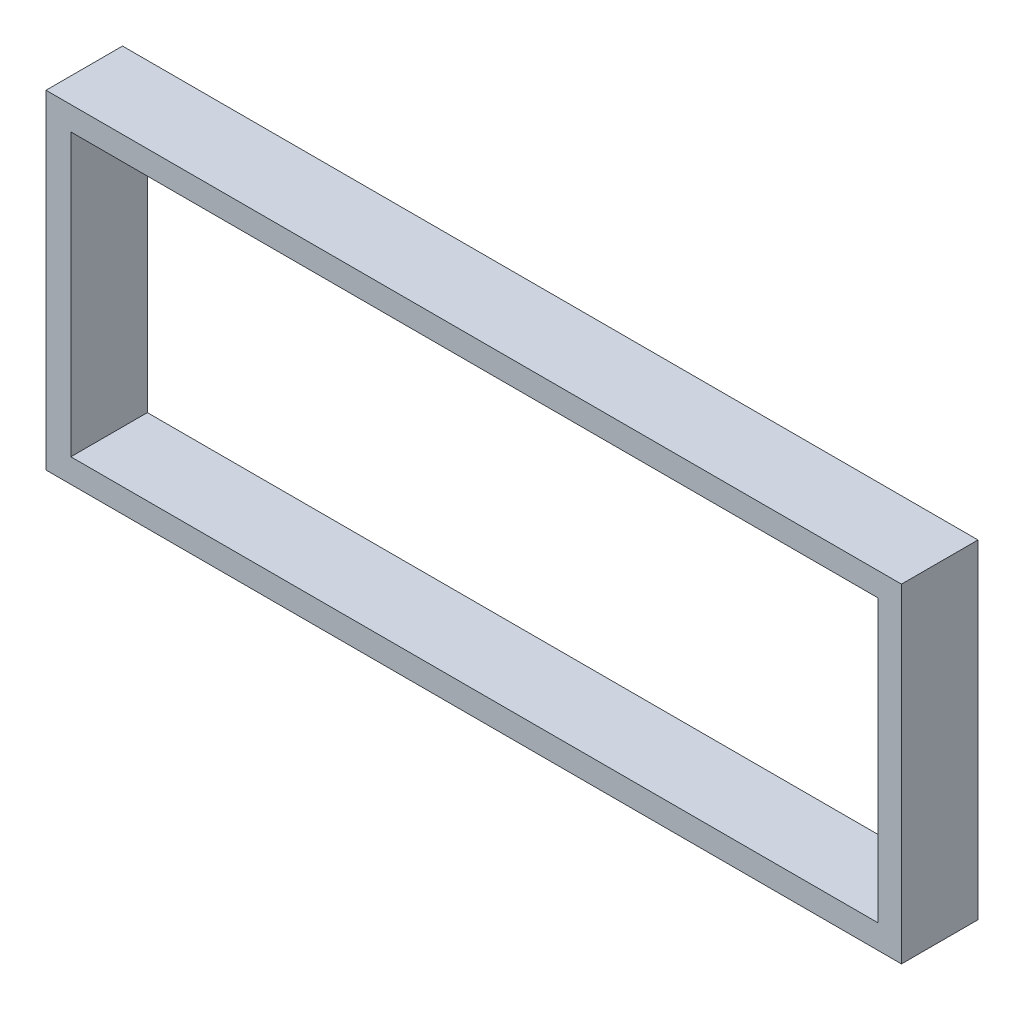
ISO-10303-21;
HEADER;
FILE_DESCRIPTION(('STEP AP214'),'2;1');
FILE_NAME('part.step','',(''),(''),'','','');
FILE_SCHEMA(('AUTOMOTIVE_DESIGN { 1 0 10303 214 1 1 1 1 }'));
ENDSEC;
DATA;
#1=APPLICATION_CONTEXT('core data for automotive mechanical design processes');
#2=APPLICATION_PROTOCOL_DEFINITION('international standard','automotive_design',2000,#1);
#3=PRODUCT_CONTEXT('',#1,'mechanical');
#4=PRODUCT('Part','Part','',(#3));
#5=PRODUCT_RELATED_PRODUCT_CATEGORY('part','',(#4));
#6=PRODUCT_DEFINITION_FORMATION('','',#4);
#7=PRODUCT_DEFINITION_CONTEXT('part definition',#1,'design');
#8=PRODUCT_DEFINITION('design','',#6,#7);
#9=PRODUCT_DEFINITION_SHAPE('','',#8);
#10=(LENGTH_UNIT() NAMED_UNIT(*) SI_UNIT(.MILLI.,.METRE.));
#11=(NAMED_UNIT(*) PLANE_ANGLE_UNIT() SI_UNIT($,.RADIAN.));
#12=(NAMED_UNIT(*) SI_UNIT($,.STERADIAN.) SOLID_ANGLE_UNIT());
#13=UNCERTAINTY_MEASURE_WITH_UNIT(LENGTH_MEASURE(1.E-05),#10,'distance_accuracy_value','');
#14=(GEOMETRIC_REPRESENTATION_CONTEXT(3) GLOBAL_UNCERTAINTY_ASSIGNED_CONTEXT((#13)) GLOBAL_UNIT_ASSIGNED_CONTEXT((#10,
#11,#12)) REPRESENTATION_CONTEXT('',''));
#15=CARTESIAN_POINT('',(0.,0.,0.));
#16=DIRECTION('',(0.,0.,1.));
#17=DIRECTION('',(1.,0.,0.));
#18=AXIS2_PLACEMENT_3D('',#15,#16,#17);
#19=CARTESIAN_POINT('',(0.,0.,6.8));
#20=DIRECTION('',(0.,0.,1.));
#21=DIRECTION('',(1.,0.,0.));
#22=AXIS2_PLACEMENT_3D('',#19,#20,#21);
#23=PLANE('',#22);
#24=DIRECTION('',(0.,-1.,0.));
#25=VECTOR('',#24,1.);
#26=CARTESIAN_POINT('',(-35.9025659824047,25.9675953079179,6.8));
#27=LINE('',#26,#25);
#28=CARTESIAN_POINT('',(-35.9025659824047,25.9675953079179,6.8));
#29=VERTEX_POINT('',#28);
#30=CARTESIAN_POINT('',(-35.9025659824047,-3.25909090909091,6.8));
#31=VERTEX_POINT('',#30);
#32=EDGE_CURVE('E159',#29,#31,#27,.T.);
#33=ORIENTED_EDGE('',*,*,#32,.T.);
#34=DIRECTION('',(1.,0.,0.));
#35=VECTOR('',#34,1.);
#36=CARTESIAN_POINT('',(-35.9025659824047,-3.25909090909091,6.8));
#37=LINE('',#36,#35);
#38=CARTESIAN_POINT('',(40.10784457478,-3.25909090909091,6.8));
#39=VERTEX_POINT('',#38);
#40=EDGE_CURVE('E163',#31,#39,#37,.T.);
#41=ORIENTED_EDGE('',*,*,#40,.T.);
#42=DIRECTION('',(0.,1.,0.));
#43=VECTOR('',#42,1.);
#44=CARTESIAN_POINT('',(40.10784457478,25.9675953079179,6.8));
#45=LINE('',#44,#43);
#46=CARTESIAN_POINT('',(40.10784457478,25.9675953079179,6.8));
#47=VERTEX_POINT('',#46);
#48=EDGE_CURVE('E167',#39,#47,#45,.T.);
#49=ORIENTED_EDGE('',*,*,#48,.T.);
#50=DIRECTION('',(-1.,0.,0.));
#51=VECTOR('',#50,1.);
#52=CARTESIAN_POINT('',(-35.9025659824047,25.9675953079179,6.8));
#53=LINE('',#52,#51);
#54=EDGE_CURVE('E170',#47,#29,#53,.T.);
#55=ORIENTED_EDGE('',*,*,#54,.T.);
#56=EDGE_LOOP('',(#33,#41,#49,#55));
#57=FACE_BOUND('',#56,.T.);
#58=DIRECTION('',(1.,0.,0.));
#59=VECTOR('',#58,1.);
#60=CARTESIAN_POINT('',(-33.6947947214076,-1.13504398826981,6.8));
#61=LINE('',#60,#59);
#62=CARTESIAN_POINT('',(-33.6947947214076,-1.13504398826981,6.8));
#63=VERTEX_POINT('',#62);
#64=CARTESIAN_POINT('',(38.0052052785924,-1.13504398826981,6.8));
#65=VERTEX_POINT('',#64);
#66=EDGE_CURVE('E120',#63,#65,#61,.T.);
#67=ORIENTED_EDGE('',*,*,#66,.F.);
#68=DIRECTION('',(0.,-1.,0.));
#69=VECTOR('',#68,1.);
#70=CARTESIAN_POINT('',(-33.6947947214076,23.8649560117302,6.8));
#71=LINE('',#70,#69);
#72=CARTESIAN_POINT('',(-33.6947947214076,23.8649560117302,6.8));
#73=VERTEX_POINT('',#72);
#74=EDGE_CURVE('E111',#73,#63,#71,.T.);
#75=ORIENTED_EDGE('',*,*,#74,.F.);
#76=DIRECTION('',(-1.,0.,0.));
#77=VECTOR('',#76,1.);
#78=CARTESIAN_POINT('',(-33.6947947214076,23.8649560117302,6.8));
#79=LINE('',#78,#77);
#80=CARTESIAN_POINT('',(38.0052052785924,23.8649560117302,6.8));
#81=VERTEX_POINT('',#80);
#82=EDGE_CURVE('E137',#81,#73,#79,.T.);
#83=ORIENTED_EDGE('',*,*,#82,.F.);
#84=DIRECTION('',(0.,1.,0.));
#85=VECTOR('',#84,1.);
#86=CARTESIAN_POINT('',(38.0052052785924,23.8649560117302,6.8));
#87=LINE('',#86,#85);
#88=EDGE_CURVE('E133',#65,#81,#87,.T.);
#89=ORIENTED_EDGE('',*,*,#88,.F.);
#90=EDGE_LOOP('',(#67,#75,#83,#89));
#91=FACE_BOUND('',#90,.T.);
#92=ADVANCED_FACE('F45',(#57,#91),#23,.T.);
#93=CARTESIAN_POINT('',(0.,0.,0.));
#94=DIRECTION('',(0.,0.,1.));
#95=DIRECTION('',(1.,0.,0.));
#96=AXIS2_PLACEMENT_3D('',#93,#94,#95);
#97=PLANE('',#96);
#98=DIRECTION('',(0.,-1.,0.));
#99=VECTOR('',#98,1.);
#100=CARTESIAN_POINT('',(-35.9025659824047,25.9675953079179,0.));
#101=LINE('',#100,#99);
#102=CARTESIAN_POINT('',(-35.9025659824047,25.9675953079179,0.));
#103=VERTEX_POINT('',#102);
#104=CARTESIAN_POINT('',(-35.9025659824047,-3.25909090909091,0.));
#105=VERTEX_POINT('',#104);
#106=EDGE_CURVE('E129',#103,#105,#101,.T.);
#107=ORIENTED_EDGE('',*,*,#106,.F.);
#108=DIRECTION('',(-1.,0.,0.));
#109=VECTOR('',#108,1.);
#110=CARTESIAN_POINT('',(-35.9025659824047,25.9675953079179,0.));
#111=LINE('',#110,#109);
#112=CARTESIAN_POINT('',(40.10784457478,25.9675953079179,0.));
#113=VERTEX_POINT('',#112);
#114=EDGE_CURVE('E164',#113,#103,#111,.T.);
#115=ORIENTED_EDGE('',*,*,#114,.F.);
#116=DIRECTION('',(0.,1.,0.));
#117=VECTOR('',#116,1.);
#118=CARTESIAN_POINT('',(40.10784457478,25.9675953079179,0.));
#119=LINE('',#118,#117);
#120=CARTESIAN_POINT('',(40.10784457478,-3.25909090909091,0.));
#121=VERTEX_POINT('',#120);
#122=EDGE_CURVE('E180',#121,#113,#119,.T.);
#123=ORIENTED_EDGE('',*,*,#122,.F.);
#124=DIRECTION('',(1.,0.,0.));
#125=VECTOR('',#124,1.);
#126=CARTESIAN_POINT('',(-35.9025659824047,-3.25909090909091,0.));
#127=LINE('',#126,#125);
#128=EDGE_CURVE('E177',#105,#121,#127,.T.);
#129=ORIENTED_EDGE('',*,*,#128,.F.);
#130=EDGE_LOOP('',(#107,#115,#123,#129));
#131=FACE_BOUND('',#130,.T.);
#132=DIRECTION('',(0.,-1.,0.));
#133=VECTOR('',#132,1.);
#134=CARTESIAN_POINT('',(-33.6947947214076,23.8649560117302,0.));
#135=LINE('',#134,#133);
#136=CARTESIAN_POINT('',(-33.6947947214076,23.8649560117302,0.));
#137=VERTEX_POINT('',#136);
#138=CARTESIAN_POINT('',(-33.6947947214076,-1.13504398826981,0.));
#139=VERTEX_POINT('',#138);
#140=EDGE_CURVE('E69',#137,#139,#135,.T.);
#141=ORIENTED_EDGE('',*,*,#140,.T.);
#142=DIRECTION('',(1.,0.,0.));
#143=VECTOR('',#142,1.);
#144=CARTESIAN_POINT('',(-33.6947947214076,-1.13504398826981,0.));
#145=LINE('',#144,#143);
#146=CARTESIAN_POINT('',(38.0052052785924,-1.13504398826981,0.));
#147=VERTEX_POINT('',#146);
#148=EDGE_CURVE('E127',#139,#147,#145,.T.);
#149=ORIENTED_EDGE('',*,*,#148,.T.);
#150=DIRECTION('',(0.,1.,0.));
#151=VECTOR('',#150,1.);
#152=CARTESIAN_POINT('',(38.0052052785924,23.8649560117302,0.));
#153=LINE('',#152,#151);
#154=CARTESIAN_POINT('',(38.0052052785924,23.8649560117302,0.));
#155=VERTEX_POINT('',#154);
#156=EDGE_CURVE('E146',#147,#155,#153,.T.);
#157=ORIENTED_EDGE('',*,*,#156,.T.);
#158=DIRECTION('',(-1.,0.,0.));
#159=VECTOR('',#158,1.);
#160=CARTESIAN_POINT('',(-33.6947947214076,23.8649560117302,0.));
#161=LINE('',#160,#159);
#162=EDGE_CURVE('E121',#155,#137,#161,.T.);
#163=ORIENTED_EDGE('',*,*,#162,.T.);
#164=EDGE_LOOP('',(#141,#149,#157,#163));
#165=FACE_BOUND('',#164,.T.);
#166=ADVANCED_FACE('F203',(#131,#165),#97,.F.);
#167=CARTESIAN_POINT('',(-35.9025659824047,25.9675953079179,6.8));
#168=DIRECTION('',(1.,0.,0.));
#169=DIRECTION('',(0.,0.,-1.));
#170=AXIS2_PLACEMENT_3D('',#167,#168,#169);
#171=PLANE('',#170);
#172=ORIENTED_EDGE('',*,*,#106,.T.);
#173=DIRECTION('',(0.,0.,-1.));
#174=VECTOR('',#173,1.);
#175=CARTESIAN_POINT('',(-35.9025659824047,-3.25909090909091,6.8));
#176=LINE('',#175,#174);
#177=EDGE_CURVE('E11',#31,#105,#176,.T.);
#178=ORIENTED_EDGE('',*,*,#177,.F.);
#179=ORIENTED_EDGE('',*,*,#32,.F.);
#180=DIRECTION('',(0.,0.,-1.));
#181=VECTOR('',#180,1.);
#182=CARTESIAN_POINT('',(-35.9025659824047,25.9675953079179,6.8));
#183=LINE('',#182,#181);
#184=EDGE_CURVE('E173',#29,#103,#183,.T.);
#185=ORIENTED_EDGE('',*,*,#184,.T.);
#186=EDGE_LOOP('',(#172,#178,#179,#185));
#187=FACE_BOUND('',#186,.T.);
#188=ADVANCED_FACE('F47',(#187),#171,.F.);
#189=CARTESIAN_POINT('',(-35.9025659824047,-3.25909090909091,6.8));
#190=DIRECTION('',(0.,1.,0.));
#191=DIRECTION('',(0.,0.,1.));
#192=AXIS2_PLACEMENT_3D('',#189,#190,#191);
#193=PLANE('',#192);
#194=ORIENTED_EDGE('',*,*,#128,.T.);
#195=DIRECTION('',(0.,0.,-1.));
#196=VECTOR('',#195,1.);
#197=CARTESIAN_POINT('',(40.10784457478,-3.25909090909091,6.8));
#198=LINE('',#197,#196);
#199=EDGE_CURVE('E54',#39,#121,#198,.T.);
#200=ORIENTED_EDGE('',*,*,#199,.F.);
#201=ORIENTED_EDGE('',*,*,#40,.F.);
#202=ORIENTED_EDGE('',*,*,#177,.T.);
#203=EDGE_LOOP('',(#194,#200,#201,#202));
#204=FACE_BOUND('',#203,.T.);
#205=ADVANCED_FACE('F213',(#204),#193,.F.);
#206=CARTESIAN_POINT('',(40.10784457478,25.9675953079179,6.8));
#207=DIRECTION('',(-1.,0.,0.));
#208=DIRECTION('',(0.,0.,1.));
#209=AXIS2_PLACEMENT_3D('',#206,#207,#208);
#210=PLANE('',#209);
#211=ORIENTED_EDGE('',*,*,#122,.T.);
#212=DIRECTION('',(0.,0.,-1.));
#213=VECTOR('',#212,1.);
#214=CARTESIAN_POINT('',(40.10784457478,25.9675953079179,6.8));
#215=LINE('',#214,#213);
#216=EDGE_CURVE('E188',#47,#113,#215,.T.);
#217=ORIENTED_EDGE('',*,*,#216,.F.);
#218=ORIENTED_EDGE('',*,*,#48,.F.);
#219=ORIENTED_EDGE('',*,*,#199,.T.);
#220=EDGE_LOOP('',(#211,#217,#218,#219));
#221=FACE_BOUND('',#220,.T.);
#222=ADVANCED_FACE('F197',(#221),#210,.F.);
#223=CARTESIAN_POINT('',(-35.9025659824047,25.9675953079179,6.8));
#224=DIRECTION('',(0.,-1.,0.));
#225=DIRECTION('',(0.,0.,-1.));
#226=AXIS2_PLACEMENT_3D('',#223,#224,#225);
#227=PLANE('',#226);
#228=ORIENTED_EDGE('',*,*,#114,.T.);
#229=ORIENTED_EDGE('',*,*,#184,.F.);
#230=ORIENTED_EDGE('',*,*,#54,.F.);
#231=ORIENTED_EDGE('',*,*,#216,.T.);
#232=EDGE_LOOP('',(#228,#229,#230,#231));
#233=FACE_BOUND('',#232,.T.);
#234=ADVANCED_FACE('F207',(#233),#227,.F.);
#235=CARTESIAN_POINT('',(-33.6947947214076,23.8649560117302,6.8));
#236=DIRECTION('',(1.,0.,0.));
#237=DIRECTION('',(0.,1.,0.));
#238=AXIS2_PLACEMENT_3D('',#235,#236,#237);
#239=PLANE('',#238);
#240=ORIENTED_EDGE('',*,*,#140,.F.);
#241=DIRECTION('',(0.,0.,-1.));
#242=VECTOR('',#241,1.);
#243=CARTESIAN_POINT('',(-33.6947947214076,23.8649560117302,6.8));
#244=LINE('',#243,#242);
#245=EDGE_CURVE('E115',#73,#137,#244,.T.);
#246=ORIENTED_EDGE('',*,*,#245,.F.);
#247=ORIENTED_EDGE('',*,*,#74,.T.);
#248=DIRECTION('',(0.,0.,-1.));
#249=VECTOR('',#248,1.);
#250=CARTESIAN_POINT('',(-33.6947947214076,-1.13504398826981,6.8));
#251=LINE('',#250,#249);
#252=EDGE_CURVE('E114',#63,#139,#251,.T.);
#253=ORIENTED_EDGE('',*,*,#252,.T.);
#254=EDGE_LOOP('',(#240,#246,#247,#253));
#255=FACE_BOUND('',#254,.T.);
#256=ADVANCED_FACE('F113',(#255),#239,.T.);
#257=CARTESIAN_POINT('',(-33.6947947214076,-1.13504398826981,6.8));
#258=DIRECTION('',(0.,1.,0.));
#259=DIRECTION('',(0.,0.,1.));
#260=AXIS2_PLACEMENT_3D('',#257,#258,#259);
#261=PLANE('',#260);
#262=ORIENTED_EDGE('',*,*,#148,.F.);
#263=ORIENTED_EDGE('',*,*,#252,.F.);
#264=ORIENTED_EDGE('',*,*,#66,.T.);
#265=DIRECTION('',(0.,0.,-1.));
#266=VECTOR('',#265,1.);
#267=CARTESIAN_POINT('',(38.0052052785924,-1.13504398826981,6.8));
#268=LINE('',#267,#266);
#269=EDGE_CURVE('E130',#65,#147,#268,.T.);
#270=ORIENTED_EDGE('',*,*,#269,.T.);
#271=EDGE_LOOP('',(#262,#263,#264,#270));
#272=FACE_BOUND('',#271,.T.);
#273=ADVANCED_FACE('F124',(#272),#261,.T.);
#274=CARTESIAN_POINT('',(38.0052052785924,23.8649560117302,6.8));
#275=DIRECTION('',(-1.,0.,0.));
#276=DIRECTION('',(0.,-1.,0.));
#277=AXIS2_PLACEMENT_3D('',#274,#275,#276);
#278=PLANE('',#277);
#279=ORIENTED_EDGE('',*,*,#156,.F.);
#280=ORIENTED_EDGE('',*,*,#269,.F.);
#281=ORIENTED_EDGE('',*,*,#88,.T.);
#282=DIRECTION('',(0.,0.,-1.));
#283=VECTOR('',#282,1.);
#284=CARTESIAN_POINT('',(38.0052052785924,23.8649560117302,6.8));
#285=LINE('',#284,#283);
#286=EDGE_CURVE('E61',#81,#155,#285,.T.);
#287=ORIENTED_EDGE('',*,*,#286,.T.);
#288=EDGE_LOOP('',(#279,#280,#281,#287));
#289=FACE_BOUND('',#288,.T.);
#290=ADVANCED_FACE('F236',(#289),#278,.T.);
#291=CARTESIAN_POINT('',(-33.6947947214076,23.8649560117302,6.8));
#292=DIRECTION('',(0.,-1.,0.));
#293=DIRECTION('',(0.,0.,-1.));
#294=AXIS2_PLACEMENT_3D('',#291,#292,#293);
#295=PLANE('',#294);
#296=ORIENTED_EDGE('',*,*,#162,.F.);
#297=ORIENTED_EDGE('',*,*,#286,.F.);
#298=ORIENTED_EDGE('',*,*,#82,.T.);
#299=ORIENTED_EDGE('',*,*,#245,.T.);
#300=EDGE_LOOP('',(#296,#297,#298,#299));
#301=FACE_BOUND('',#300,.T.);
#302=ADVANCED_FACE('F240',(#301),#295,.T.);
#303=CLOSED_SHELL('',(#92,#166,#188,#205,#222,#234,#256,#273,#290,#302));
#304=MANIFOLD_SOLID_BREP('B2',#303);
#305=ADVANCED_BREP_SHAPE_REPRESENTATION('',(#18,#304),#14);
#306=SHAPE_DEFINITION_REPRESENTATION(#9,#305);
ENDSEC;
END-ISO-10303-21;
